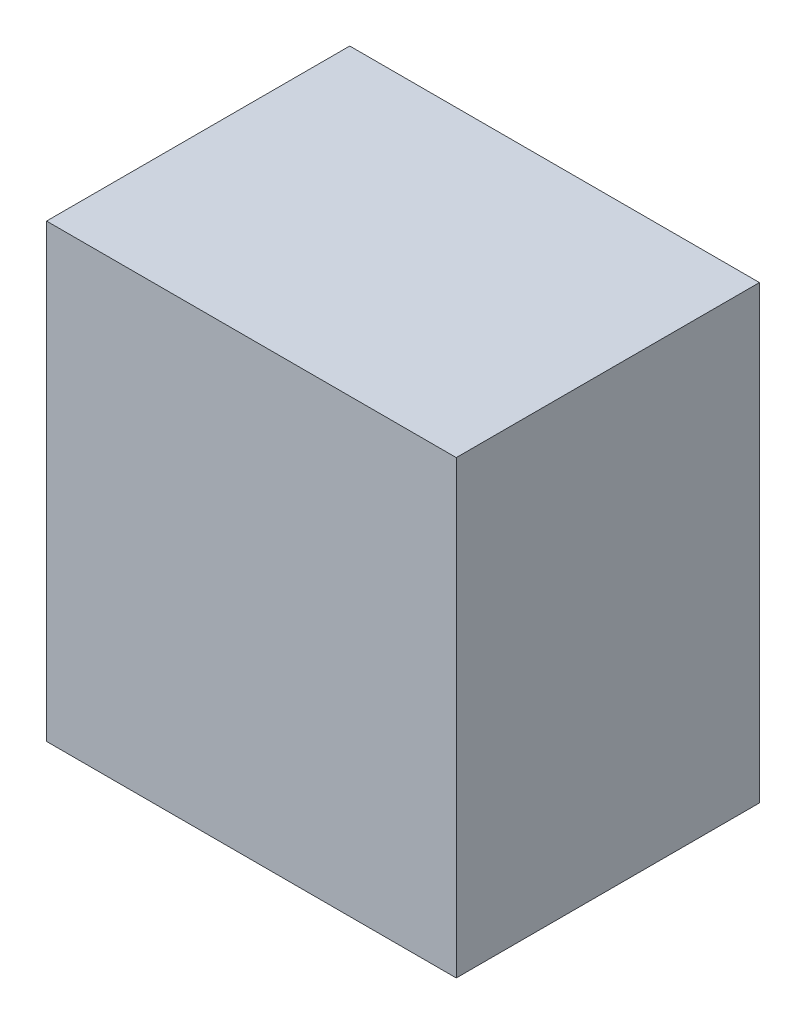
ISO-10303-21;
HEADER;
FILE_DESCRIPTION(('STEP AP214'),'2;1');
FILE_NAME('part.step','',(''),(''),'','','');
FILE_SCHEMA(('AUTOMOTIVE_DESIGN { 1 0 10303 214 1 1 1 1 }'));
ENDSEC;
DATA;
#1=APPLICATION_CONTEXT('core data for automotive mechanical design processes');
#2=APPLICATION_PROTOCOL_DEFINITION('international standard','automotive_design',2000,#1);
#3=PRODUCT_CONTEXT('',#1,'mechanical');
#4=PRODUCT('Part','Part','',(#3));
#5=PRODUCT_RELATED_PRODUCT_CATEGORY('part','',(#4));
#6=PRODUCT_DEFINITION_FORMATION('','',#4);
#7=PRODUCT_DEFINITION_CONTEXT('part definition',#1,'design');
#8=PRODUCT_DEFINITION('design','',#6,#7);
#9=PRODUCT_DEFINITION_SHAPE('','',#8);
#10=(LENGTH_UNIT() NAMED_UNIT(*) SI_UNIT(.MILLI.,.METRE.));
#11=(NAMED_UNIT(*) PLANE_ANGLE_UNIT() SI_UNIT($,.RADIAN.));
#12=(NAMED_UNIT(*) SI_UNIT($,.STERADIAN.) SOLID_ANGLE_UNIT());
#13=UNCERTAINTY_MEASURE_WITH_UNIT(LENGTH_MEASURE(1.E-05),#10,'distance_accuracy_value','');
#14=(GEOMETRIC_REPRESENTATION_CONTEXT(3) GLOBAL_UNCERTAINTY_ASSIGNED_CONTEXT((#13)) GLOBAL_UNIT_ASSIGNED_CONTEXT((#10,
#11,#12)) REPRESENTATION_CONTEXT('',''));
#15=CARTESIAN_POINT('',(0.,0.,0.));
#16=DIRECTION('',(0.,0.,1.));
#17=DIRECTION('',(1.,0.,0.));
#18=AXIS2_PLACEMENT_3D('',#15,#16,#17);
#19=CARTESIAN_POINT('',(25.,27.5,37.));
#20=DIRECTION('',(-1.,0.,0.));
#21=DIRECTION('',(0.,-1.,0.));
#22=AXIS2_PLACEMENT_3D('',#19,#20,#21);
#23=PLANE('',#22);
#24=DIRECTION('',(0.,1.,0.));
#25=VECTOR('',#24,1.);
#26=CARTESIAN_POINT('',(25.,27.5,0.));
#27=LINE('',#26,#25);
#28=CARTESIAN_POINT('',(25.,-27.5,0.));
#29=VERTEX_POINT('',#28);
#30=CARTESIAN_POINT('',(25.,27.5,0.));
#31=VERTEX_POINT('',#30);
#32=EDGE_CURVE('E101',#29,#31,#27,.T.);
#33=ORIENTED_EDGE('',*,*,#32,.T.);
#34=DIRECTION('',(0.,0.,-1.));
#35=VECTOR('',#34,1.);
#36=CARTESIAN_POINT('',(25.,27.5,37.));
#37=LINE('',#36,#35);
#38=CARTESIAN_POINT('',(25.,27.5,37.));
#39=VERTEX_POINT('',#38);
#40=EDGE_CURVE('E92',#39,#31,#37,.T.);
#41=ORIENTED_EDGE('',*,*,#40,.F.);
#42=DIRECTION('',(0.,1.,0.));
#43=VECTOR('',#42,1.);
#44=CARTESIAN_POINT('',(25.,27.5,37.));
#45=LINE('',#44,#43);
#46=CARTESIAN_POINT('',(25.,-27.5,37.));
#47=VERTEX_POINT('',#46);
#48=EDGE_CURVE('E86',#47,#39,#45,.T.);
#49=ORIENTED_EDGE('',*,*,#48,.F.);
#50=DIRECTION('',(0.,0.,-1.));
#51=VECTOR('',#50,1.);
#52=CARTESIAN_POINT('',(25.,-27.5,37.));
#53=LINE('',#52,#51);
#54=EDGE_CURVE('E97',#47,#29,#53,.T.);
#55=ORIENTED_EDGE('',*,*,#54,.T.);
#56=EDGE_LOOP('',(#33,#41,#49,#55));
#57=FACE_BOUND('',#56,.T.);
#58=ADVANCED_FACE('F33',(#57),#23,.F.);
#59=CARTESIAN_POINT('',(-25.,27.5,37.));
#60=DIRECTION('',(0.,-1.,0.));
#61=DIRECTION('',(0.,0.,-1.));
#62=AXIS2_PLACEMENT_3D('',#59,#60,#61);
#63=PLANE('',#62);
#64=DIRECTION('',(-1.,0.,0.));
#65=VECTOR('',#64,1.);
#66=CARTESIAN_POINT('',(-25.,27.5,0.));
#67=LINE('',#66,#65);
#68=CARTESIAN_POINT('',(-25.,27.5,0.));
#69=VERTEX_POINT('',#68);
#70=EDGE_CURVE('E91',#31,#69,#67,.T.);
#71=ORIENTED_EDGE('',*,*,#70,.T.);
#72=DIRECTION('',(0.,0.,-1.));
#73=VECTOR('',#72,1.);
#74=CARTESIAN_POINT('',(-25.,27.5,37.));
#75=LINE('',#74,#73);
#76=CARTESIAN_POINT('',(-25.,27.5,37.));
#77=VERTEX_POINT('',#76);
#78=EDGE_CURVE('E89',#77,#69,#75,.T.);
#79=ORIENTED_EDGE('',*,*,#78,.F.);
#80=DIRECTION('',(-1.,0.,0.));
#81=VECTOR('',#80,1.);
#82=CARTESIAN_POINT('',(-25.,27.5,37.));
#83=LINE('',#82,#81);
#84=EDGE_CURVE('E81',#39,#77,#83,.T.);
#85=ORIENTED_EDGE('',*,*,#84,.F.);
#86=ORIENTED_EDGE('',*,*,#40,.T.);
#87=EDGE_LOOP('',(#71,#79,#85,#86));
#88=FACE_BOUND('',#87,.T.);
#89=ADVANCED_FACE('F90',(#88),#63,.F.);
#90=CARTESIAN_POINT('',(-25.,27.5,37.));
#91=DIRECTION('',(1.,0.,0.));
#92=DIRECTION('',(0.,1.,0.));
#93=AXIS2_PLACEMENT_3D('',#90,#91,#92);
#94=PLANE('',#93);
#95=DIRECTION('',(0.,-1.,0.));
#96=VECTOR('',#95,1.);
#97=CARTESIAN_POINT('',(-25.,27.5,0.));
#98=LINE('',#97,#96);
#99=CARTESIAN_POINT('',(-25.,-27.5,0.));
#100=VERTEX_POINT('',#99);
#101=EDGE_CURVE('E67',#69,#100,#98,.T.);
#102=ORIENTED_EDGE('',*,*,#101,.T.);
#103=DIRECTION('',(0.,0.,-1.));
#104=VECTOR('',#103,1.);
#105=CARTESIAN_POINT('',(-25.,-27.5,37.));
#106=LINE('',#105,#104);
#107=CARTESIAN_POINT('',(-25.,-27.5,37.));
#108=VERTEX_POINT('',#107);
#109=EDGE_CURVE('E93',#108,#100,#106,.T.);
#110=ORIENTED_EDGE('',*,*,#109,.F.);
#111=DIRECTION('',(0.,-1.,0.));
#112=VECTOR('',#111,1.);
#113=CARTESIAN_POINT('',(-25.,27.5,37.));
#114=LINE('',#113,#112);
#115=EDGE_CURVE('E84',#77,#108,#114,.T.);
#116=ORIENTED_EDGE('',*,*,#115,.F.);
#117=ORIENTED_EDGE('',*,*,#78,.T.);
#118=EDGE_LOOP('',(#102,#110,#116,#117));
#119=FACE_BOUND('',#118,.T.);
#120=ADVANCED_FACE('F95',(#119),#94,.F.);
#121=CARTESIAN_POINT('',(-25.,-27.5,37.));
#122=DIRECTION('',(0.,1.,0.));
#123=DIRECTION('',(0.,0.,1.));
#124=AXIS2_PLACEMENT_3D('',#121,#122,#123);
#125=PLANE('',#124);
#126=DIRECTION('',(1.,0.,0.));
#127=VECTOR('',#126,1.);
#128=CARTESIAN_POINT('',(-25.,-27.5,0.));
#129=LINE('',#128,#127);
#130=EDGE_CURVE('E73',#100,#29,#129,.T.);
#131=ORIENTED_EDGE('',*,*,#130,.T.);
#132=ORIENTED_EDGE('',*,*,#54,.F.);
#133=DIRECTION('',(1.,0.,0.));
#134=VECTOR('',#133,1.);
#135=CARTESIAN_POINT('',(-25.,-27.5,37.));
#136=LINE('',#135,#134);
#137=EDGE_CURVE('E50',#108,#47,#136,.T.);
#138=ORIENTED_EDGE('',*,*,#137,.F.);
#139=ORIENTED_EDGE('',*,*,#109,.T.);
#140=EDGE_LOOP('',(#131,#132,#138,#139));
#141=FACE_BOUND('',#140,.T.);
#142=ADVANCED_FACE('F134',(#141),#125,.F.);
#143=CARTESIAN_POINT('',(0.,0.,37.));
#144=DIRECTION('',(0.,0.,1.));
#145=DIRECTION('',(1.,0.,0.));
#146=AXIS2_PLACEMENT_3D('',#143,#144,#145);
#147=PLANE('',#146);
#148=ORIENTED_EDGE('',*,*,#48,.T.);
#149=ORIENTED_EDGE('',*,*,#84,.T.);
#150=ORIENTED_EDGE('',*,*,#115,.T.);
#151=ORIENTED_EDGE('',*,*,#137,.T.);
#152=EDGE_LOOP('',(#148,#149,#150,#151));
#153=FACE_BOUND('',#152,.T.);
#154=ADVANCED_FACE('F82',(#153),#147,.T.);
#155=CARTESIAN_POINT('',(0.,0.,0.));
#156=DIRECTION('',(0.,0.,1.));
#157=DIRECTION('',(1.,0.,0.));
#158=AXIS2_PLACEMENT_3D('',#155,#156,#157);
#159=PLANE('',#158);
#160=CARTESIAN_POINT('',(0.,0.,0.));
#161=DIRECTION('',(0.,0.,1.));
#162=DIRECTION('',(1.,0.,0.));
#163=AXIS2_PLACEMENT_3D('',#160,#161,#162);
#164=CIRCLE('',#163,7.5);
#165=CARTESIAN_POINT('',(7.5,0.,0.));
#166=VERTEX_POINT('',#165);
#167=EDGE_CURVE('E104',#166,#166,#164,.T.);
#168=ORIENTED_EDGE('',*,*,#167,.T.);
#169=EDGE_LOOP('',(#168));
#170=FACE_BOUND('',#169,.T.);
#171=ORIENTED_EDGE('',*,*,#32,.F.);
#172=ORIENTED_EDGE('',*,*,#130,.F.);
#173=ORIENTED_EDGE('',*,*,#101,.F.);
#174=ORIENTED_EDGE('',*,*,#70,.F.);
#175=EDGE_LOOP('',(#171,#172,#173,#174));
#176=FACE_BOUND('',#175,.T.);
#177=ADVANCED_FACE('F137',(#170,#176),#159,.F.);
#178=CARTESIAN_POINT('',(0.,0.,-10.));
#179=DIRECTION('',(0.,0.,1.));
#180=DIRECTION('',(1.,0.,0.));
#181=AXIS2_PLACEMENT_3D('',#178,#179,#180);
#182=CYLINDRICAL_SURFACE('',#181,7.5);
#183=CARTESIAN_POINT('',(0.,0.,-8.));
#184=DIRECTION('',(0.,0.,1.));
#185=DIRECTION('',(1.,0.,0.));
#186=AXIS2_PLACEMENT_3D('',#183,#184,#185);
#187=CIRCLE('',#186,7.5);
#188=CARTESIAN_POINT('',(7.5,0.,-8.));
#189=VERTEX_POINT('',#188);
#190=EDGE_CURVE('E42',#189,#189,#187,.T.);
#191=ORIENTED_EDGE('',*,*,#190,.T.);
#192=EDGE_LOOP('',(#191));
#193=FACE_BOUND('',#192,.T.);
#194=ORIENTED_EDGE('',*,*,#167,.F.);
#195=EDGE_LOOP('',(#194));
#196=FACE_BOUND('',#195,.T.);
#197=ADVANCED_FACE('F113',(#193,#196),#182,.T.);
#198=CARTESIAN_POINT('',(0.,0.,-10.));
#199=DIRECTION('',(0.,0.,1.));
#200=DIRECTION('',(1.,0.,0.));
#201=AXIS2_PLACEMENT_3D('',#198,#199,#200);
#202=PLANE('',#201);
#203=CARTESIAN_POINT('',(0.,0.,-10.));
#204=DIRECTION('',(0.,0.,1.));
#205=DIRECTION('',(1.,0.,0.));
#206=AXIS2_PLACEMENT_3D('',#203,#204,#205);
#207=CIRCLE('',#206,5.5);
#208=CARTESIAN_POINT('',(5.5,0.,-10.));
#209=VERTEX_POINT('',#208);
#210=EDGE_CURVE('E11',#209,#209,#207,.F.);
#211=ORIENTED_EDGE('',*,*,#210,.T.);
#212=EDGE_LOOP('',(#211));
#213=FACE_BOUND('',#212,.T.);
#214=ADVANCED_FACE('F117',(#213),#202,.F.);
#215=CARTESIAN_POINT('',(0.,0.,-8.));
#216=DIRECTION('',(0.,0.,1.));
#217=DIRECTION('',(1.,0.,0.));
#218=AXIS2_PLACEMENT_3D('',#215,#216,#217);
#219=TOROIDAL_SURFACE('',#218,5.5,2.);
#220=ORIENTED_EDGE('',*,*,#210,.F.);
#221=EDGE_LOOP('',(#220));
#222=FACE_BOUND('',#221,.T.);
#223=ORIENTED_EDGE('',*,*,#190,.F.);
#224=EDGE_LOOP('',(#223));
#225=FACE_BOUND('',#224,.T.);
#226=ADVANCED_FACE('F35',(#222,#225),#219,.T.);
#227=CLOSED_SHELL('',(#58,#89,#120,#142,#154,#177,#197,#214,#226));
#228=MANIFOLD_SOLID_BREP('B2',#227);
#229=ADVANCED_BREP_SHAPE_REPRESENTATION('',(#18,#228),#14);
#230=SHAPE_DEFINITION_REPRESENTATION(#9,#229);
ENDSEC;
END-ISO-10303-21;
